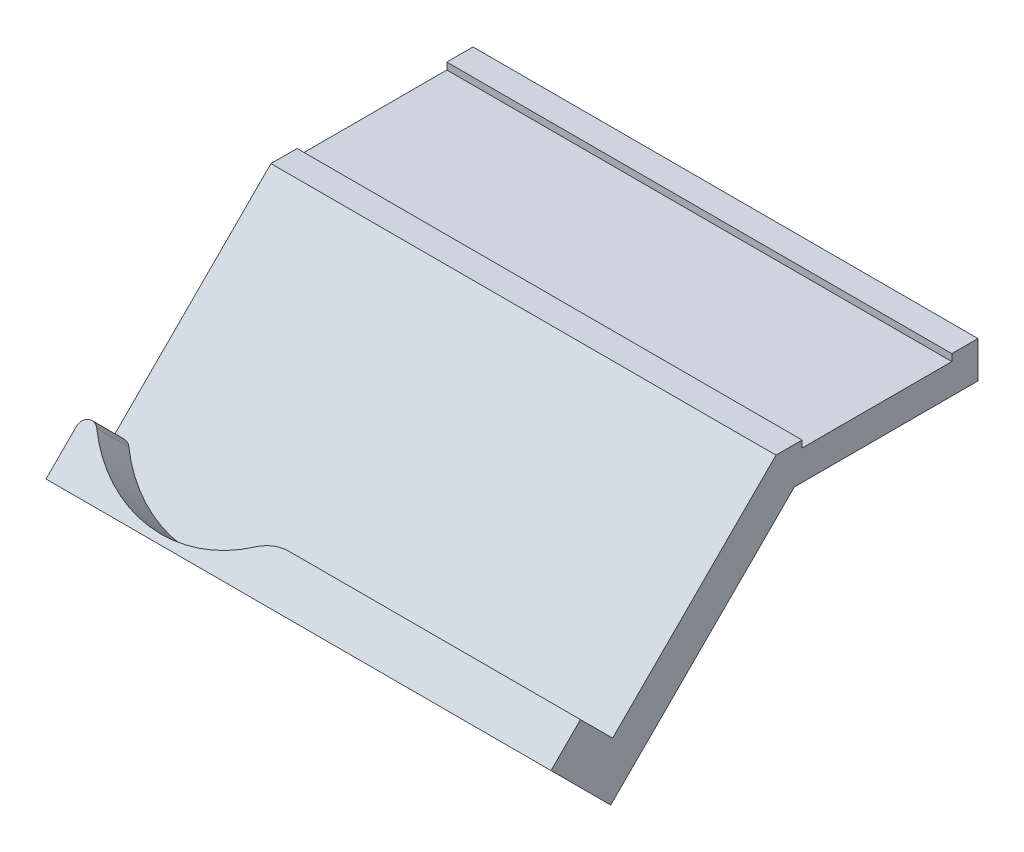
ISO-10303-21;
HEADER;
FILE_DESCRIPTION(('STEP AP214'),'2;1');
FILE_NAME('part.step','',(''),(''),'','','');
FILE_SCHEMA(('AUTOMOTIVE_DESIGN { 1 0 10303 214 1 1 1 1 }'));
ENDSEC;
DATA;
#1=APPLICATION_CONTEXT('core data for automotive mechanical design processes');
#2=APPLICATION_PROTOCOL_DEFINITION('international standard','automotive_design',2000,#1);
#3=PRODUCT_CONTEXT('',#1,'mechanical');
#4=PRODUCT('Part','Part','',(#3));
#5=PRODUCT_RELATED_PRODUCT_CATEGORY('part','',(#4));
#6=PRODUCT_DEFINITION_FORMATION('','',#4);
#7=PRODUCT_DEFINITION_CONTEXT('part definition',#1,'design');
#8=PRODUCT_DEFINITION('design','',#6,#7);
#9=PRODUCT_DEFINITION_SHAPE('','',#8);
#10=(LENGTH_UNIT() NAMED_UNIT(*) SI_UNIT(.MILLI.,.METRE.));
#11=(NAMED_UNIT(*) PLANE_ANGLE_UNIT() SI_UNIT($,.RADIAN.));
#12=(NAMED_UNIT(*) SI_UNIT($,.STERADIAN.) SOLID_ANGLE_UNIT());
#13=UNCERTAINTY_MEASURE_WITH_UNIT(LENGTH_MEASURE(1.E-05),#10,'distance_accuracy_value','');
#14=(GEOMETRIC_REPRESENTATION_CONTEXT(3) GLOBAL_UNCERTAINTY_ASSIGNED_CONTEXT((#13)) GLOBAL_UNIT_ASSIGNED_CONTEXT((#10,
#11,#12)) REPRESENTATION_CONTEXT('',''));
#15=CARTESIAN_POINT('',(0.,0.,0.));
#16=DIRECTION('',(0.,0.,1.));
#17=DIRECTION('',(1.,0.,0.));
#18=AXIS2_PLACEMENT_3D('',#15,#16,#17);
#19=CARTESIAN_POINT('',(55.,24.5,-46.5));
#20=DIRECTION('',(0.,-1.,0.));
#21=DIRECTION('',(0.,0.,-1.));
#22=AXIS2_PLACEMENT_3D('',#19,#20,#21);
#23=PLANE('',#22);
#24=DIRECTION('',(0.,0.,1.));
#25=VECTOR('',#24,1.);
#26=CARTESIAN_POINT('',(0.,24.5,-46.5));
#27=LINE('',#26,#25);
#28=CARTESIAN_POINT('',(0.,24.5,-46.5));
#29=VERTEX_POINT('',#28);
#30=CARTESIAN_POINT('',(0.,24.5,-43.65));
#31=VERTEX_POINT('',#30);
#32=EDGE_CURVE('E187',#29,#31,#27,.T.);
#33=ORIENTED_EDGE('',*,*,#32,.T.);
#34=DIRECTION('',(-1.,0.,0.));
#35=VECTOR('',#34,1.);
#36=CARTESIAN_POINT('',(0.,24.5,-43.65));
#37=LINE('',#36,#35);
#38=CARTESIAN_POINT('',(55.,24.5,-43.65));
#39=VERTEX_POINT('',#38);
#40=EDGE_CURVE('E158',#39,#31,#37,.T.);
#41=ORIENTED_EDGE('',*,*,#40,.F.);
#42=DIRECTION('',(0.,0.,1.));
#43=VECTOR('',#42,1.);
#44=CARTESIAN_POINT('',(55.,24.5,-46.5));
#45=LINE('',#44,#43);
#46=CARTESIAN_POINT('',(55.,24.5,-46.5));
#47=VERTEX_POINT('',#46);
#48=EDGE_CURVE('E184',#47,#39,#45,.T.);
#49=ORIENTED_EDGE('',*,*,#48,.F.);
#50=DIRECTION('',(1.,0.,0.));
#51=VECTOR('',#50,1.);
#52=CARTESIAN_POINT('',(55.,24.5,-46.5));
#53=LINE('',#52,#51);
#54=EDGE_CURVE('E181',#29,#47,#53,.T.);
#55=ORIENTED_EDGE('',*,*,#54,.F.);
#56=EDGE_LOOP('',(#33,#41,#49,#55));
#57=FACE_BOUND('',#56,.T.);
#58=ADVANCED_FACE('F34',(#57),#23,.F.);
#59=CARTESIAN_POINT('',(0.,50.,-29.));
#60=DIRECTION('',(1.,0.,0.));
#61=DIRECTION('',(0.,0.,-1.));
#62=AXIS2_PLACEMENT_3D('',#59,#60,#61);
#63=PLANE('',#62);
#64=DIRECTION('',(0.,0.,1.));
#65=VECTOR('',#64,1.);
#66=CARTESIAN_POINT('',(0.,23.75,-43.65));
#67=LINE('',#66,#65);
#68=CARTESIAN_POINT('',(0.,23.75,-43.65));
#69=VERTEX_POINT('',#68);
#70=CARTESIAN_POINT('',(0.,23.75,-27.35));
#71=VERTEX_POINT('',#70);
#72=EDGE_CURVE('E149',#69,#71,#67,.T.);
#73=ORIENTED_EDGE('',*,*,#72,.F.);
#74=DIRECTION('',(0.,1.,0.));
#75=VECTOR('',#74,1.);
#76=CARTESIAN_POINT('',(0.,23.75,-43.65));
#77=LINE('',#76,#75);
#78=EDGE_CURVE('E174',#69,#31,#77,.T.);
#79=ORIENTED_EDGE('',*,*,#78,.T.);
#80=ORIENTED_EDGE('',*,*,#32,.F.);
#81=DIRECTION('',(0.,1.,0.));
#82=VECTOR('',#81,1.);
#83=CARTESIAN_POINT('',(0.,24.5,-46.5));
#84=LINE('',#83,#82);
#85=CARTESIAN_POINT('',(0.,20.5,-46.5));
#86=VERTEX_POINT('',#85);
#87=EDGE_CURVE('E179',#86,#29,#84,.T.);
#88=ORIENTED_EDGE('',*,*,#87,.F.);
#89=DIRECTION('',(0.,0.,1.));
#90=VECTOR('',#89,1.);
#91=CARTESIAN_POINT('',(0.,20.5,-46.5));
#92=LINE('',#91,#90);
#93=CARTESIAN_POINT('',(0.,20.5,-26.5));
#94=VERTEX_POINT('',#93);
#95=EDGE_CURVE('E190',#86,#94,#92,.T.);
#96=ORIENTED_EDGE('',*,*,#95,.T.);
#97=DIRECTION('',(0.,-0.707106781186548,0.707106781186547));
#98=VECTOR('',#97,1.);
#99=CARTESIAN_POINT('',(0.,18.5,-24.5));
#100=LINE('',#99,#98);
#101=CARTESIAN_POINT('',(0.,0.500000000000003,-6.50000000000002));
#102=VERTEX_POINT('',#101);
#103=EDGE_CURVE('E191',#94,#102,#100,.T.);
#104=ORIENTED_EDGE('',*,*,#103,.T.);
#105=DIRECTION('',(0.,0.707106781186547,0.707106781186548));
#106=VECTOR('',#105,1.);
#107=CARTESIAN_POINT('',(0.,0.500000000000003,-6.50000000000002));
#108=LINE('',#107,#106);
#109=CARTESIAN_POINT('',(0.,7.,0.));
#110=VERTEX_POINT('',#109);
#111=EDGE_CURVE('E193',#102,#110,#108,.T.);
#112=ORIENTED_EDGE('',*,*,#111,.T.);
#113=DIRECTION('',(0.,0.707106781186549,-0.707106781186546));
#114=VECTOR('',#113,1.);
#115=CARTESIAN_POINT('',(0.,2.42893218813452,4.57106781186546));
#116=LINE('',#115,#114);
#117=CARTESIAN_POINT('',(0.,10.3045772723613,-3.30457727236129));
#118=VERTEX_POINT('',#117);
#119=EDGE_CURVE('E221',#110,#118,#116,.T.);
#120=ORIENTED_EDGE('',*,*,#119,.T.);
#121=DIRECTION('',(0.,0.707106781186547,0.707106781186547));
#122=VECTOR('',#121,1.);
#123=CARTESIAN_POINT('',(0.,6.80457727236129,-6.80457727236129));
#124=LINE('',#123,#122);
#125=CARTESIAN_POINT('',(0.,6.80457727236129,-6.80457727236129));
#126=VERTEX_POINT('',#125);
#127=EDGE_CURVE('E236',#118,#126,#124,.F.);
#128=ORIENTED_EDGE('',*,*,#127,.T.);
#129=DIRECTION('',(0.,-0.707106781186548,0.707106781186548));
#130=VECTOR('',#129,1.);
#131=CARTESIAN_POINT('',(0.,39.5,-39.5));
#132=LINE('',#131,#130);
#133=CARTESIAN_POINT('',(0.,24.5,-24.5));
#134=VERTEX_POINT('',#133);
#135=EDGE_CURVE('E209',#134,#126,#132,.T.);
#136=ORIENTED_EDGE('',*,*,#135,.F.);
#137=CARTESIAN_POINT('',(0.,24.5,-27.35));
#138=VERTEX_POINT('',#137);
#139=EDGE_CURVE('E163',#138,#134,#27,.T.);
#140=ORIENTED_EDGE('',*,*,#139,.F.);
#141=DIRECTION('',(0.,1.,0.));
#142=VECTOR('',#141,1.);
#143=CARTESIAN_POINT('',(0.,23.75,-27.35));
#144=LINE('',#143,#142);
#145=EDGE_CURVE('E51',#71,#138,#144,.T.);
#146=ORIENTED_EDGE('',*,*,#145,.F.);
#147=EDGE_LOOP('',(#73,#79,#80,#88,#96,#104,#112,#120,#128,#136,#140,#146));
#148=FACE_BOUND('',#147,.T.);
#149=ADVANCED_FACE('F161',(#148),#63,.F.);
#150=CARTESIAN_POINT('',(55.,50.,-29.));
#151=DIRECTION('',(1.,0.,0.));
#152=DIRECTION('',(0.,0.,-1.));
#153=AXIS2_PLACEMENT_3D('',#150,#151,#152);
#154=PLANE('',#153);
#155=DIRECTION('',(0.,1.,0.));
#156=VECTOR('',#155,1.);
#157=CARTESIAN_POINT('',(55.,23.75,-43.65));
#158=LINE('',#157,#156);
#159=CARTESIAN_POINT('',(55.,23.75,-43.65));
#160=VERTEX_POINT('',#159);
#161=EDGE_CURVE('E165',#160,#39,#158,.T.);
#162=ORIENTED_EDGE('',*,*,#161,.F.);
#163=DIRECTION('',(0.,0.,-1.));
#164=VECTOR('',#163,1.);
#165=CARTESIAN_POINT('',(55.,23.75,-43.65));
#166=LINE('',#165,#164);
#167=CARTESIAN_POINT('',(55.,23.75,-27.35));
#168=VERTEX_POINT('',#167);
#169=EDGE_CURVE('E148',#168,#160,#166,.T.);
#170=ORIENTED_EDGE('',*,*,#169,.F.);
#171=DIRECTION('',(0.,1.,0.));
#172=VECTOR('',#171,1.);
#173=CARTESIAN_POINT('',(55.,23.75,-27.35));
#174=LINE('',#173,#172);
#175=CARTESIAN_POINT('',(55.,24.5,-27.35));
#176=VERTEX_POINT('',#175);
#177=EDGE_CURVE('E145',#168,#176,#174,.T.);
#178=ORIENTED_EDGE('',*,*,#177,.T.);
#179=CARTESIAN_POINT('',(55.,24.5,-24.5));
#180=VERTEX_POINT('',#179);
#181=EDGE_CURVE('E183',#176,#180,#45,.T.);
#182=ORIENTED_EDGE('',*,*,#181,.T.);
#183=DIRECTION('',(0.,0.707106781186548,-0.707106781186547));
#184=VECTOR('',#183,1.);
#185=CARTESIAN_POINT('',(55.,6.,-6.00000000000001));
#186=LINE('',#185,#184);
#187=CARTESIAN_POINT('',(55.,6.70710678118655,-6.70710678118656));
#188=VERTEX_POINT('',#187);
#189=EDGE_CURVE('E228',#188,#180,#186,.T.);
#190=ORIENTED_EDGE('',*,*,#189,.F.);
#191=DIRECTION('',(0.,0.707106781186547,0.707106781186548));
#192=VECTOR('',#191,1.);
#193=CARTESIAN_POINT('',(55.,6.70710678118655,-6.70710678118656));
#194=LINE('',#193,#192);
#195=CARTESIAN_POINT('',(55.,10.2071067811866,-3.20710678118655));
#196=VERTEX_POINT('',#195);
#197=EDGE_CURVE('E213',#188,#196,#194,.T.);
#198=ORIENTED_EDGE('',*,*,#197,.T.);
#199=DIRECTION('',(0.,0.707106781186549,-0.707106781186546));
#200=VECTOR('',#199,1.);
#201=CARTESIAN_POINT('',(55.,2.42893218813452,4.57106781186546));
#202=LINE('',#201,#200);
#203=CARTESIAN_POINT('',(55.,7.,0.));
#204=VERTEX_POINT('',#203);
#205=EDGE_CURVE('E219',#204,#196,#202,.T.);
#206=ORIENTED_EDGE('',*,*,#205,.F.);
#207=DIRECTION('',(0.,0.707106781186547,0.707106781186548));
#208=VECTOR('',#207,1.);
#209=CARTESIAN_POINT('',(55.,0.500000000000003,-6.50000000000002));
#210=LINE('',#209,#208);
#211=CARTESIAN_POINT('',(55.,0.500000000000003,-6.50000000000002));
#212=VERTEX_POINT('',#211);
#213=EDGE_CURVE('E194',#212,#204,#210,.T.);
#214=ORIENTED_EDGE('',*,*,#213,.F.);
#215=DIRECTION('',(0.,-0.707106781186548,0.707106781186547));
#216=VECTOR('',#215,1.);
#217=CARTESIAN_POINT('',(55.,18.5,-24.5));
#218=LINE('',#217,#216);
#219=CARTESIAN_POINT('',(55.,20.5,-26.5));
#220=VERTEX_POINT('',#219);
#221=EDGE_CURVE('E198',#220,#212,#218,.T.);
#222=ORIENTED_EDGE('',*,*,#221,.F.);
#223=DIRECTION('',(0.,0.,1.));
#224=VECTOR('',#223,1.);
#225=CARTESIAN_POINT('',(55.,20.5,-46.5));
#226=LINE('',#225,#224);
#227=CARTESIAN_POINT('',(55.,20.5,-46.5));
#228=VERTEX_POINT('',#227);
#229=EDGE_CURVE('E200',#228,#220,#226,.T.);
#230=ORIENTED_EDGE('',*,*,#229,.F.);
#231=DIRECTION('',(0.,-1.,0.));
#232=VECTOR('',#231,1.);
#233=CARTESIAN_POINT('',(55.,24.5,-46.5));
#234=LINE('',#233,#232);
#235=EDGE_CURVE('E173',#47,#228,#234,.T.);
#236=ORIENTED_EDGE('',*,*,#235,.F.);
#237=ORIENTED_EDGE('',*,*,#48,.T.);
#238=EDGE_LOOP('',(#162,#170,#178,#182,#190,#198,#206,#214,#222,#230,#236,#237));
#239=FACE_BOUND('',#238,.T.);
#240=ADVANCED_FACE('F259',(#239),#154,.T.);
#241=CARTESIAN_POINT('',(5.,6.,-6.00000000000001));
#242=DIRECTION('',(0.,-0.707106781186547,-0.707106781186548));
#243=DIRECTION('',(0.,0.707106781186548,-0.707106781186547));
#244=AXIS2_PLACEMENT_3D('',#241,#242,#243);
#245=PLANE('',#244);
#246=ORIENTED_EDGE('',*,*,#189,.T.);
#247=DIRECTION('',(1.,0.,0.));
#248=VECTOR('',#247,1.);
#249=CARTESIAN_POINT('',(0.,24.5,-24.5));
#250=LINE('',#249,#248);
#251=EDGE_CURVE('E204',#134,#180,#250,.T.);
#252=ORIENTED_EDGE('',*,*,#251,.F.);
#253=ORIENTED_EDGE('',*,*,#135,.T.);
#254=CARTESIAN_POINT('',(1.,6.80457727236129,-6.8045772723613));
#255=DIRECTION('',(0.,-0.707106781186547,-0.707106781186548));
#256=DIRECTION('',(0.,0.707106781186548,-0.707106781186547));
#257=AXIS2_PLACEMENT_3D('',#254,#255,#256);
#258=CIRCLE('',#257,1.);
#259=CARTESIAN_POINT('',(1.74576271186441,7.27566005574052,-7.27566005574052));
#260=VERTEX_POINT('',#259);
#261=EDGE_CURVE('E239',#126,#260,#258,.T.);
#262=ORIENTED_EDGE('',*,*,#261,.T.);
#263=CARTESIAN_POINT('',(12.,13.7530483272049,-13.7530483272049));
#264=DIRECTION('',(0.,0.707106781186548,0.707106781186548));
#265=DIRECTION('',(0.,-0.707106781186548,0.707106781186548));
#266=AXIS2_PLACEMENT_3D('',#263,#264,#265);
#267=CIRCLE('',#266,13.75);
#268=CARTESIAN_POINT('',(20.2846304274471,5.99329966244078,-5.99329966244078));
#269=VERTEX_POINT('',#268);
#270=EDGE_CURVE('E207',#260,#269,#267,.T.);
#271=ORIENTED_EDGE('',*,*,#270,.T.);
#272=CARTESIAN_POINT('',(23.2972233101551,3.1715728752538,-3.17157287525382));
#273=DIRECTION('',(0.,-0.707106781186547,-0.707106781186548));
#274=DIRECTION('',(0.,0.707106781186548,-0.707106781186547));
#275=AXIS2_PLACEMENT_3D('',#272,#273,#274);
#276=CIRCLE('',#275,5.);
#277=CARTESIAN_POINT('',(23.2972233101551,6.70710678118655,-6.70710678118656));
#278=VERTEX_POINT('',#277);
#279=EDGE_CURVE('E11',#269,#278,#276,.T.);
#280=ORIENTED_EDGE('',*,*,#279,.T.);
#281=DIRECTION('',(1.,0.,0.));
#282=VECTOR('',#281,1.);
#283=CARTESIAN_POINT('',(0.,6.70710678118655,-6.70710678118656));
#284=LINE('',#283,#282);
#285=EDGE_CURVE('E216',#278,#188,#284,.T.);
#286=ORIENTED_EDGE('',*,*,#285,.T.);
#287=EDGE_LOOP('',(#246,#252,#253,#262,#271,#280,#286));
#288=FACE_BOUND('',#287,.T.);
#289=ADVANCED_FACE('F309',(#288),#245,.F.);
#290=CARTESIAN_POINT('',(0.,6.70710678118655,-6.70710678118656));
#291=DIRECTION('',(0.,0.707106781186548,-0.707106781186547));
#292=DIRECTION('',(0.,0.707106781186547,0.707106781186548));
#293=AXIS2_PLACEMENT_3D('',#290,#291,#292);
#294=PLANE('',#293);
#295=ORIENTED_EDGE('',*,*,#285,.F.);
#296=DIRECTION('',(0.,-0.707106781186547,-0.707106781186548));
#297=VECTOR('',#296,1.);
#298=CARTESIAN_POINT('',(23.2972233101551,6.70710678118655,-6.70710678118656));
#299=LINE('',#298,#297);
#300=CARTESIAN_POINT('',(23.2972233101551,10.2071067811866,-3.20710678118655));
#301=VERTEX_POINT('',#300);
#302=EDGE_CURVE('E241',#278,#301,#299,.F.);
#303=ORIENTED_EDGE('',*,*,#302,.T.);
#304=DIRECTION('',(1.,0.,0.));
#305=VECTOR('',#304,1.);
#306=CARTESIAN_POINT('',(0.,10.2071067811866,-3.20710678118655));
#307=LINE('',#306,#305);
#308=EDGE_CURVE('E217',#301,#196,#307,.T.);
#309=ORIENTED_EDGE('',*,*,#308,.T.);
#310=ORIENTED_EDGE('',*,*,#197,.F.);
#311=EDGE_LOOP('',(#295,#303,#309,#310));
#312=FACE_BOUND('',#311,.T.);
#313=ADVANCED_FACE('F314',(#312),#294,.T.);
#314=CARTESIAN_POINT('',(0.,2.42893218813452,4.57106781186546));
#315=DIRECTION('',(0.,-0.707106781186546,-0.707106781186549));
#316=DIRECTION('',(0.,0.707106781186549,-0.707106781186546));
#317=AXIS2_PLACEMENT_3D('',#314,#315,#316);
#318=PLANE('',#317);
#319=ORIENTED_EDGE('',*,*,#308,.F.);
#320=CARTESIAN_POINT('',(23.2972233101551,6.67157287525381,0.328427124746185));
#321=DIRECTION('',(0.,-0.707106781186546,-0.707106781186549));
#322=DIRECTION('',(0.,0.707106781186549,-0.707106781186546));
#323=AXIS2_PLACEMENT_3D('',#320,#321,#322);
#324=CIRCLE('',#323,5.);
#325=CARTESIAN_POINT('',(20.2846304274471,9.49329966244078,-2.49329966244078));
#326=VERTEX_POINT('',#325);
#327=EDGE_CURVE('E244',#301,#326,#324,.F.);
#328=ORIENTED_EDGE('',*,*,#327,.T.);
#329=CARTESIAN_POINT('',(12.,17.253048327205,-10.2530483272049));
#330=DIRECTION('',(0.,-0.707106781186546,-0.707106781186549));
#331=DIRECTION('',(0.,0.707106781186549,-0.707106781186546));
#332=AXIS2_PLACEMENT_3D('',#329,#330,#331);
#333=CIRCLE('',#332,13.75);
#334=CARTESIAN_POINT('',(1.74576271186441,10.7756600557405,-3.77566005574052));
#335=VERTEX_POINT('',#334);
#336=EDGE_CURVE('E211',#335,#326,#333,.F.);
#337=ORIENTED_EDGE('',*,*,#336,.F.);
#338=CARTESIAN_POINT('',(1.,10.3045772723613,-3.30457727236129));
#339=DIRECTION('',(0.,-0.707106781186546,-0.707106781186549));
#340=DIRECTION('',(0.,0.707106781186549,-0.707106781186546));
#341=AXIS2_PLACEMENT_3D('',#338,#339,#340);
#342=CIRCLE('',#341,1.);
#343=EDGE_CURVE('E234',#335,#118,#342,.F.);
#344=ORIENTED_EDGE('',*,*,#343,.T.);
#345=ORIENTED_EDGE('',*,*,#119,.F.);
#346=DIRECTION('',(-1.,0.,0.));
#347=VECTOR('',#346,1.);
#348=CARTESIAN_POINT('',(0.,6.99999999999999,0.));
#349=LINE('',#348,#347);
#350=EDGE_CURVE('E224',#204,#110,#349,.T.);
#351=ORIENTED_EDGE('',*,*,#350,.F.);
#352=ORIENTED_EDGE('',*,*,#205,.T.);
#353=EDGE_LOOP('',(#319,#328,#337,#344,#345,#351,#352));
#354=FACE_BOUND('',#353,.T.);
#355=ADVANCED_FACE('F319',(#354),#318,.F.);
#356=CARTESIAN_POINT('',(12.,38.753048327205,11.2469516727951));
#357=DIRECTION('',(0.,-0.707106781186547,-0.707106781186547));
#358=DIRECTION('',(0.,0.707106781186548,-0.707106781186548));
#359=AXIS2_PLACEMENT_3D('',#356,#357,#358);
#360=CYLINDRICAL_SURFACE('',#359,13.75);
#361=ORIENTED_EDGE('',*,*,#336,.T.);
#362=DIRECTION('',(0.,-0.707106781186547,-0.707106781186547));
#363=VECTOR('',#362,1.);
#364=CARTESIAN_POINT('',(20.2846304274471,30.9932996624408,19.0067003375592));
#365=LINE('',#364,#363);
#366=EDGE_CURVE('E43',#326,#269,#365,.T.);
#367=ORIENTED_EDGE('',*,*,#366,.T.);
#368=ORIENTED_EDGE('',*,*,#270,.F.);
#369=DIRECTION('',(0.,-0.707106781186547,-0.707106781186547));
#370=VECTOR('',#369,1.);
#371=CARTESIAN_POINT('',(1.7457627118644,32.2756600557405,17.7243399442595));
#372=LINE('',#371,#370);
#373=EDGE_CURVE('E231',#260,#335,#372,.F.);
#374=ORIENTED_EDGE('',*,*,#373,.T.);
#375=EDGE_LOOP('',(#361,#367,#368,#374));
#376=FACE_BOUND('',#375,.T.);
#377=ADVANCED_FACE('F320',(#376),#360,.F.);
#378=CARTESIAN_POINT('',(1.,31.8045772723613,18.1954227276387));
#379=DIRECTION('',(0.,-0.707106781186547,-0.707106781186547));
#380=DIRECTION('',(0.,0.707106781186548,-0.707106781186548));
#381=AXIS2_PLACEMENT_3D('',#378,#379,#380);
#382=CYLINDRICAL_SURFACE('',#381,1.);
#383=ORIENTED_EDGE('',*,*,#261,.F.);
#384=ORIENTED_EDGE('',*,*,#127,.F.);
#385=ORIENTED_EDGE('',*,*,#343,.F.);
#386=ORIENTED_EDGE('',*,*,#373,.F.);
#387=EDGE_LOOP('',(#383,#384,#385,#386));
#388=FACE_BOUND('',#387,.T.);
#389=ADVANCED_FACE('F324',(#388),#382,.T.);
#390=CARTESIAN_POINT('',(23.2972233101551,28.1715728752538,21.8284271247462));
#391=DIRECTION('',(0.,-0.707106781186547,-0.707106781186547));
#392=DIRECTION('',(0.,0.707106781186548,-0.707106781186548));
#393=AXIS2_PLACEMENT_3D('',#390,#391,#392);
#394=CYLINDRICAL_SURFACE('',#393,5.);
#395=ORIENTED_EDGE('',*,*,#279,.F.);
#396=ORIENTED_EDGE('',*,*,#366,.F.);
#397=ORIENTED_EDGE('',*,*,#327,.F.);
#398=ORIENTED_EDGE('',*,*,#302,.F.);
#399=EDGE_LOOP('',(#395,#396,#397,#398));
#400=FACE_BOUND('',#399,.T.);
#401=ADVANCED_FACE('F36',(#400),#394,.T.);
#402=CARTESIAN_POINT('',(0.,0.500000000000003,-6.50000000000002));
#403=DIRECTION('',(0.,0.707106781186548,-0.707106781186547));
#404=DIRECTION('',(0.,0.707106781186547,0.707106781186548));
#405=AXIS2_PLACEMENT_3D('',#402,#403,#404);
#406=PLANE('',#405);
#407=ORIENTED_EDGE('',*,*,#213,.T.);
#408=ORIENTED_EDGE('',*,*,#350,.T.);
#409=ORIENTED_EDGE('',*,*,#111,.F.);
#410=DIRECTION('',(1.,0.,0.));
#411=VECTOR('',#410,1.);
#412=CARTESIAN_POINT('',(0.,0.500000000000003,-6.50000000000002));
#413=LINE('',#412,#411);
#414=EDGE_CURVE('E197',#102,#212,#413,.T.);
#415=ORIENTED_EDGE('',*,*,#414,.T.);
#416=EDGE_LOOP('',(#407,#408,#409,#415));
#417=FACE_BOUND('',#416,.T.);
#418=ADVANCED_FACE('F328',(#417),#406,.F.);
#419=CARTESIAN_POINT('',(0.,18.5,-24.5));
#420=DIRECTION('',(0.,0.707106781186547,0.707106781186548));
#421=DIRECTION('',(0.,-0.707106781186548,0.707106781186547));
#422=AXIS2_PLACEMENT_3D('',#419,#420,#421);
#423=PLANE('',#422);
#424=ORIENTED_EDGE('',*,*,#414,.F.);
#425=ORIENTED_EDGE('',*,*,#103,.F.);
#426=DIRECTION('',(-1.,0.,0.));
#427=VECTOR('',#426,1.);
#428=CARTESIAN_POINT('',(55.,20.5,-26.5));
#429=LINE('',#428,#427);
#430=EDGE_CURVE('E170',#220,#94,#429,.T.);
#431=ORIENTED_EDGE('',*,*,#430,.F.);
#432=ORIENTED_EDGE('',*,*,#221,.T.);
#433=EDGE_LOOP('',(#424,#425,#431,#432));
#434=FACE_BOUND('',#433,.T.);
#435=ADVANCED_FACE('F264',(#434),#423,.F.);
#436=CARTESIAN_POINT('',(55.,20.5,-46.5));
#437=DIRECTION('',(0.,1.,0.));
#438=DIRECTION('',(0.,0.,1.));
#439=AXIS2_PLACEMENT_3D('',#436,#437,#438);
#440=PLANE('',#439);
#441=ORIENTED_EDGE('',*,*,#229,.T.);
#442=ORIENTED_EDGE('',*,*,#430,.T.);
#443=ORIENTED_EDGE('',*,*,#95,.F.);
#444=DIRECTION('',(-1.,0.,0.));
#445=VECTOR('',#444,1.);
#446=CARTESIAN_POINT('',(55.,20.5,-46.5));
#447=LINE('',#446,#445);
#448=EDGE_CURVE('E177',#228,#86,#447,.T.);
#449=ORIENTED_EDGE('',*,*,#448,.F.);
#450=EDGE_LOOP('',(#441,#442,#443,#449));
#451=FACE_BOUND('',#450,.T.);
#452=ADVANCED_FACE('F253',(#451),#440,.F.);
#453=ORIENTED_EDGE('',*,*,#181,.F.);
#454=DIRECTION('',(1.,0.,0.));
#455=VECTOR('',#454,1.);
#456=CARTESIAN_POINT('',(0.,24.5,-27.35));
#457=LINE('',#456,#455);
#458=EDGE_CURVE('E279',#138,#176,#457,.T.);
#459=ORIENTED_EDGE('',*,*,#458,.F.);
#460=ORIENTED_EDGE('',*,*,#139,.T.);
#461=ORIENTED_EDGE('',*,*,#251,.T.);
#462=EDGE_LOOP('',(#453,#459,#460,#461));
#463=FACE_BOUND('',#462,.T.);
#464=ADVANCED_FACE('F289',(#463),#23,.F.);
#465=CARTESIAN_POINT('',(0.,0.,-46.5));
#466=DIRECTION('',(0.,0.,-1.));
#467=DIRECTION('',(-1.,0.,0.));
#468=AXIS2_PLACEMENT_3D('',#465,#466,#467);
#469=PLANE('',#468);
#470=ORIENTED_EDGE('',*,*,#235,.T.);
#471=ORIENTED_EDGE('',*,*,#448,.T.);
#472=ORIENTED_EDGE('',*,*,#87,.T.);
#473=ORIENTED_EDGE('',*,*,#54,.T.);
#474=EDGE_LOOP('',(#470,#471,#472,#473));
#475=FACE_BOUND('',#474,.T.);
#476=ADVANCED_FACE('F271',(#475),#469,.T.);
#477=CARTESIAN_POINT('',(0.,23.75,-43.65));
#478=DIRECTION('',(0.,0.,-1.));
#479=DIRECTION('',(-1.,0.,0.));
#480=AXIS2_PLACEMENT_3D('',#477,#478,#479);
#481=PLANE('',#480);
#482=ORIENTED_EDGE('',*,*,#40,.T.);
#483=ORIENTED_EDGE('',*,*,#78,.F.);
#484=DIRECTION('',(-1.,0.,0.));
#485=VECTOR('',#484,1.);
#486=CARTESIAN_POINT('',(0.,23.75,-43.65));
#487=LINE('',#486,#485);
#488=EDGE_CURVE('E155',#160,#69,#487,.T.);
#489=ORIENTED_EDGE('',*,*,#488,.F.);
#490=ORIENTED_EDGE('',*,*,#161,.T.);
#491=EDGE_LOOP('',(#482,#483,#489,#490));
#492=FACE_BOUND('',#491,.T.);
#493=ADVANCED_FACE('F281',(#492),#481,.F.);
#494=CARTESIAN_POINT('',(0.,23.75,-27.35));
#495=DIRECTION('',(0.,0.,1.));
#496=DIRECTION('',(1.,0.,0.));
#497=AXIS2_PLACEMENT_3D('',#494,#495,#496);
#498=PLANE('',#497);
#499=ORIENTED_EDGE('',*,*,#458,.T.);
#500=ORIENTED_EDGE('',*,*,#177,.F.);
#501=DIRECTION('',(1.,0.,0.));
#502=VECTOR('',#501,1.);
#503=CARTESIAN_POINT('',(0.,23.75,-27.35));
#504=LINE('',#503,#502);
#505=EDGE_CURVE('E141',#71,#168,#504,.T.);
#506=ORIENTED_EDGE('',*,*,#505,.F.);
#507=ORIENTED_EDGE('',*,*,#145,.T.);
#508=EDGE_LOOP('',(#499,#500,#506,#507));
#509=FACE_BOUND('',#508,.T.);
#510=ADVANCED_FACE('F143',(#509),#498,.F.);
#511=CARTESIAN_POINT('',(0.,23.75,0.));
#512=DIRECTION('',(0.,1.,0.));
#513=DIRECTION('',(0.,0.,1.));
#514=AXIS2_PLACEMENT_3D('',#511,#512,#513);
#515=PLANE('',#514);
#516=ORIENTED_EDGE('',*,*,#72,.T.);
#517=ORIENTED_EDGE('',*,*,#505,.T.);
#518=ORIENTED_EDGE('',*,*,#169,.T.);
#519=ORIENTED_EDGE('',*,*,#488,.T.);
#520=EDGE_LOOP('',(#516,#517,#518,#519));
#521=FACE_BOUND('',#520,.T.);
#522=ADVANCED_FACE('F153',(#521),#515,.T.);
#523=CLOSED_SHELL('',(#58,#149,#240,#289,#313,#355,#377,#389,#401,#418,#435,#452,#464,#476,#493,
#510,#522));
#524=MANIFOLD_SOLID_BREP('B2',#523);
#525=ADVANCED_BREP_SHAPE_REPRESENTATION('',(#18,#524),#14);
#526=SHAPE_DEFINITION_REPRESENTATION(#9,#525);
ENDSEC;
END-ISO-10303-21;
